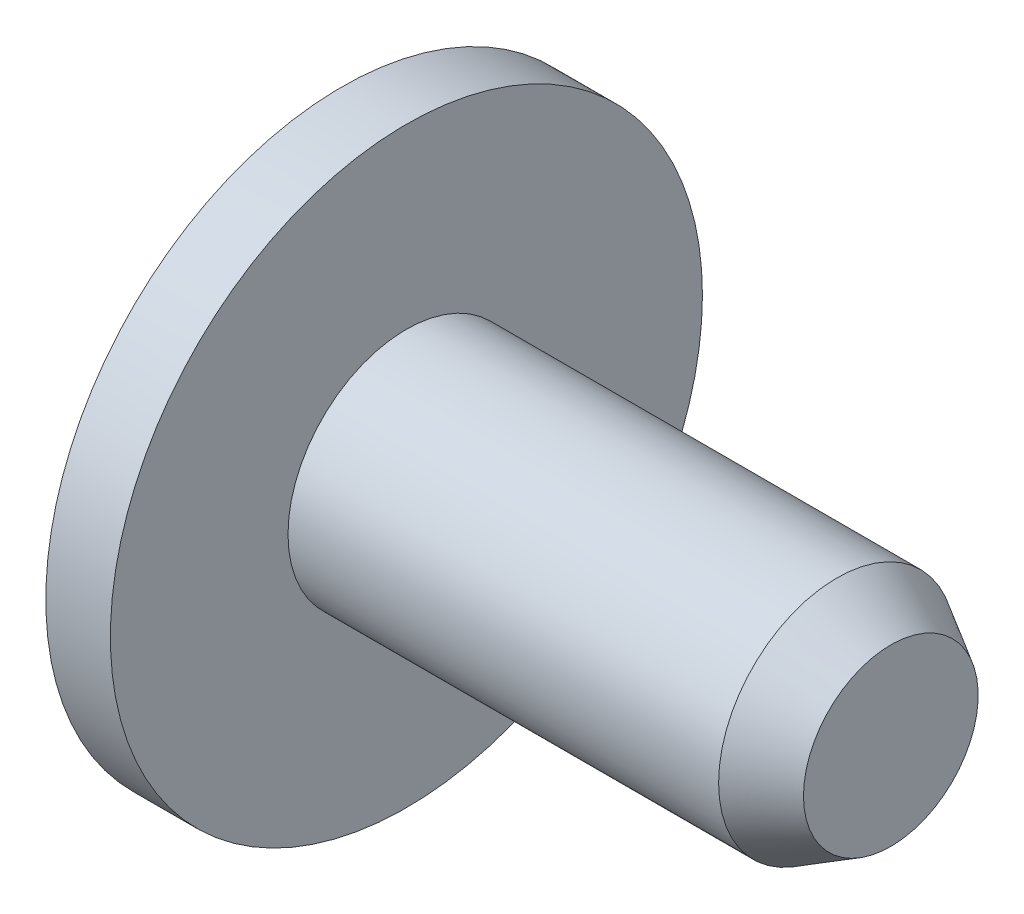
ISO-10303-21;
HEADER;
FILE_DESCRIPTION(('STEP AP214'),'2;1');
FILE_NAME('part.step','',(''),(''),'','','');
FILE_SCHEMA(('AUTOMOTIVE_DESIGN { 1 0 10303 214 1 1 1 1 }'));
ENDSEC;
DATA;
#1=APPLICATION_CONTEXT('core data for automotive mechanical design processes');
#2=APPLICATION_PROTOCOL_DEFINITION('international standard','automotive_design',2000,#1);
#3=PRODUCT_CONTEXT('',#1,'mechanical');
#4=PRODUCT('Part','Part','',(#3));
#5=PRODUCT_RELATED_PRODUCT_CATEGORY('part','',(#4));
#6=PRODUCT_DEFINITION_FORMATION('','',#4);
#7=PRODUCT_DEFINITION_CONTEXT('part definition',#1,'design');
#8=PRODUCT_DEFINITION('design','',#6,#7);
#9=PRODUCT_DEFINITION_SHAPE('','',#8);
#10=(LENGTH_UNIT() NAMED_UNIT(*) SI_UNIT(.MILLI.,.METRE.));
#11=(NAMED_UNIT(*) PLANE_ANGLE_UNIT() SI_UNIT($,.RADIAN.));
#12=(NAMED_UNIT(*) SI_UNIT($,.STERADIAN.) SOLID_ANGLE_UNIT());
#13=UNCERTAINTY_MEASURE_WITH_UNIT(LENGTH_MEASURE(1.E-05),#10,'distance_accuracy_value','');
#14=(GEOMETRIC_REPRESENTATION_CONTEXT(3) GLOBAL_UNCERTAINTY_ASSIGNED_CONTEXT((#13)) GLOBAL_UNIT_ASSIGNED_CONTEXT((#10,
#11,#12)) REPRESENTATION_CONTEXT('',''));
#15=CARTESIAN_POINT('',(0.,0.,0.));
#16=DIRECTION('',(0.,0.,1.));
#17=DIRECTION('',(1.,0.,0.));
#18=AXIS2_PLACEMENT_3D('',#15,#16,#17);
#19=CARTESIAN_POINT('',(4.5,0.811324865405192,0.));
#20=DIRECTION('',(-1.,0.,0.));
#21=DIRECTION('',(0.,0.,1.));
#22=AXIS2_PLACEMENT_3D('',#19,#20,#21);
#23=PLANE('',#22);
#24=CARTESIAN_POINT('',(4.5,0.,0.));
#25=DIRECTION('',(-1.,0.,0.));
#26=DIRECTION('',(0.,0.,1.));
#27=AXIS2_PLACEMENT_3D('',#24,#25,#26);
#28=CIRCLE('',#27,0.811324865405191);
#29=CARTESIAN_POINT('',(4.5,0.,0.811324865405154));
#30=VERTEX_POINT('',#29);
#31=EDGE_CURVE('E197',#30,#30,#28,.T.);
#32=ORIENTED_EDGE('',*,*,#31,.F.);
#33=EDGE_LOOP('',(#32));
#34=FACE_BOUND('',#33,.T.);
#35=ADVANCED_FACE('F40',(#34),#23,.F.);
#36=CARTESIAN_POINT('',(4.5,0.,0.));
#37=DIRECTION('',(-1.,0.,0.));
#38=DIRECTION('',(0.,0.,1.));
#39=AXIS2_PLACEMENT_3D('',#36,#37,#38);
#40=CONICAL_SURFACE('',#39,0.811324865405191,0.523598775598294);
#41=CARTESIAN_POINT('',(4.,0.,0.));
#42=DIRECTION('',(-1.,0.,0.));
#43=DIRECTION('',(0.,0.,1.));
#44=AXIS2_PLACEMENT_3D('',#41,#42,#43);
#45=CIRCLE('',#44,1.1);
#46=CARTESIAN_POINT('',(4.,0.,1.1));
#47=VERTEX_POINT('',#46);
#48=EDGE_CURVE('E193',#47,#47,#45,.T.);
#49=ORIENTED_EDGE('',*,*,#48,.F.);
#50=EDGE_LOOP('',(#49));
#51=FACE_BOUND('',#50,.T.);
#52=ORIENTED_EDGE('',*,*,#31,.T.);
#53=EDGE_LOOP('',(#52));
#54=FACE_BOUND('',#53,.T.);
#55=ADVANCED_FACE('F268',(#51,#54),#40,.T.);
#56=CARTESIAN_POINT('',(-2.18226579762636,0.,0.));
#57=DIRECTION('',(-1.,0.,0.));
#58=DIRECTION('',(0.,0.,1.));
#59=AXIS2_PLACEMENT_3D('',#56,#57,#58);
#60=CYLINDRICAL_SURFACE('',#59,1.1);
#61=CARTESIAN_POINT('',(0.,0.,0.));
#62=DIRECTION('',(-1.,0.,0.));
#63=DIRECTION('',(0.,0.,1.));
#64=AXIS2_PLACEMENT_3D('',#61,#62,#63);
#65=CIRCLE('',#64,1.1);
#66=CARTESIAN_POINT('',(0.,0.,1.10000000000001));
#67=VERTEX_POINT('',#66);
#68=EDGE_CURVE('E189',#67,#67,#65,.T.);
#69=ORIENTED_EDGE('',*,*,#68,.F.);
#70=EDGE_LOOP('',(#69));
#71=FACE_BOUND('',#70,.T.);
#72=ORIENTED_EDGE('',*,*,#48,.T.);
#73=EDGE_LOOP('',(#72));
#74=FACE_BOUND('',#73,.T.);
#75=ADVANCED_FACE('F263',(#71,#74),#60,.T.);
#76=CARTESIAN_POINT('',(0.,1.09999999999995,0.));
#77=DIRECTION('',(-1.,0.,0.));
#78=DIRECTION('',(0.,0.,1.));
#79=AXIS2_PLACEMENT_3D('',#76,#77,#78);
#80=PLANE('',#79);
#81=ORIENTED_EDGE('',*,*,#68,.T.);
#82=EDGE_LOOP('',(#81));
#83=FACE_BOUND('',#82,.T.);
#84=CARTESIAN_POINT('',(0.,0.,0.));
#85=DIRECTION('',(1.,0.,0.));
#86=DIRECTION('',(0.,0.,-1.));
#87=AXIS2_PLACEMENT_3D('',#84,#85,#86);
#88=CIRCLE('',#87,2.75);
#89=CARTESIAN_POINT('',(0.,0.,-2.75000000000001));
#90=VERTEX_POINT('',#89);
#91=EDGE_CURVE('E236',#90,#90,#88,.T.);
#92=ORIENTED_EDGE('',*,*,#91,.T.);
#93=EDGE_LOOP('',(#92));
#94=FACE_BOUND('',#93,.T.);
#95=ADVANCED_FACE('F251',(#83,#94),#80,.F.);
#96=CARTESIAN_POINT('',(-0.6,0.,0.));
#97=DIRECTION('',(1.,0.,0.));
#98=DIRECTION('',(0.,0.,-1.));
#99=AXIS2_PLACEMENT_3D('',#96,#97,#98);
#100=CYLINDRICAL_SURFACE('',#99,2.75);
#101=CARTESIAN_POINT('',(-0.6,0.,0.));
#102=DIRECTION('',(1.,0.,0.));
#103=DIRECTION('',(0.,0.,-1.));
#104=AXIS2_PLACEMENT_3D('',#101,#102,#103);
#105=CIRCLE('',#104,2.75);
#106=CARTESIAN_POINT('',(-0.6,0.,-2.75000000000001));
#107=VERTEX_POINT('',#106);
#108=EDGE_CURVE('E239',#107,#107,#105,.T.);
#109=ORIENTED_EDGE('',*,*,#108,.T.);
#110=EDGE_LOOP('',(#109));
#111=FACE_BOUND('',#110,.T.);
#112=ORIENTED_EDGE('',*,*,#91,.F.);
#113=EDGE_LOOP('',(#112));
#114=FACE_BOUND('',#113,.T.);
#115=ADVANCED_FACE('F253',(#111,#114),#100,.T.);
#116=CARTESIAN_POINT('',(-0.6,0.,0.));
#117=DIRECTION('',(1.,0.,0.));
#118=DIRECTION('',(0.,0.,-1.));
#119=AXIS2_PLACEMENT_3D('',#116,#117,#118);
#120=PLANE('',#119);
#121=CARTESIAN_POINT('',(-0.6,0.,0.));
#122=DIRECTION('',(1.,0.,0.));
#123=DIRECTION('',(0.,0.,-1.));
#124=AXIS2_PLACEMENT_3D('',#121,#122,#123);
#125=CIRCLE('',#124,1.88923048454133);
#126=CARTESIAN_POINT('',(-0.6,0.,-1.88923048454134));
#127=VERTEX_POINT('',#126);
#128=EDGE_CURVE('E11',#127,#127,#125,.T.);
#129=ORIENTED_EDGE('',*,*,#128,.T.);
#130=EDGE_LOOP('',(#129));
#131=FACE_BOUND('',#130,.T.);
#132=ORIENTED_EDGE('',*,*,#108,.F.);
#133=EDGE_LOOP('',(#132));
#134=FACE_BOUND('',#133,.T.);
#135=ADVANCED_FACE('F255',(#131,#134),#120,.F.);
#136=CARTESIAN_POINT('',(-1.2,-0.200000000000013,-2.05000000000002));
#137=DIRECTION('',(0.,-1.,0.));
#138=DIRECTION('',(1.,0.,0.));
#139=AXIS2_PLACEMENT_3D('',#136,#137,#138);
#140=PLANE('',#139);
#141=CARTESIAN_POINT('',(0.905985363406005,-0.20000000000002,0.));
#142=DIRECTION('',(0.,-1.,0.));
#143=DIRECTION('',(1.,0.,0.));
#144=AXIS2_PLACEMENT_3D('',#141,#142,#143);
#145=CIRCLE('',#144,2.49799172168467);
#146=CARTESIAN_POINT('',(-1.58398705443421,-0.200000000000033,-0.20000000000002));
#147=VERTEX_POINT('',#146);
#148=CARTESIAN_POINT('',(-1.19999999999998,-0.200000000000006,-1.34342409191025));
#149=VERTEX_POINT('',#148);
#150=EDGE_CURVE('E174',#147,#149,#145,.T.);
#151=ORIENTED_EDGE('',*,*,#150,.F.);
#152=DIRECTION('',(1.,0.,0.));
#153=VECTOR('',#152,1.);
#154=CARTESIAN_POINT('',(-1.19999999999998,-0.200000000000023,-0.200000000000027));
#155=LINE('',#154,#153);
#156=CARTESIAN_POINT('',(-1.19999999999998,-0.200000000000034,-0.20000000000002));
#157=VERTEX_POINT('',#156);
#158=EDGE_CURVE('E49',#147,#157,#155,.T.);
#159=ORIENTED_EDGE('',*,*,#158,.T.);
#160=DIRECTION('',(0.,0.,1.));
#161=VECTOR('',#160,1.);
#162=CARTESIAN_POINT('',(-1.2,-0.200000000000013,-2.05000000000002));
#163=LINE('',#162,#161);
#164=EDGE_CURVE('E172',#149,#157,#163,.T.);
#165=ORIENTED_EDGE('',*,*,#164,.F.);
#166=EDGE_LOOP('',(#151,#159,#165));
#167=FACE_BOUND('',#166,.T.);
#168=ADVANCED_FACE('F171',(#167),#140,.F.);
#169=CARTESIAN_POINT('',(-1.19999999999998,-2.05000000000004,-0.200000000000027));
#170=DIRECTION('',(0.,0.,-1.));
#171=DIRECTION('',(0.,1.,0.));
#172=AXIS2_PLACEMENT_3D('',#169,#170,#171);
#173=PLANE('',#172);
#174=DIRECTION('',(0.,1.,0.));
#175=VECTOR('',#174,1.);
#176=CARTESIAN_POINT('',(-1.19999999999998,-2.05000000000004,-0.200000000000027));
#177=LINE('',#176,#175);
#178=CARTESIAN_POINT('',(-1.2,-1.34342409191023,-0.200000000000027));
#179=VERTEX_POINT('',#178);
#180=EDGE_CURVE('E114',#179,#157,#177,.T.);
#181=ORIENTED_EDGE('',*,*,#180,.T.);
#182=ORIENTED_EDGE('',*,*,#158,.F.);
#183=CARTESIAN_POINT('',(0.905985363406026,0.,-0.200000000000082));
#184=DIRECTION('',(0.,0.,-1.));
#185=DIRECTION('',(0.,1.,0.));
#186=AXIS2_PLACEMENT_3D('',#183,#184,#185);
#187=CIRCLE('',#186,2.49799172168467);
#188=EDGE_CURVE('E209',#179,#147,#187,.T.);
#189=ORIENTED_EDGE('',*,*,#188,.F.);
#190=EDGE_LOOP('',(#181,#182,#189));
#191=FACE_BOUND('',#190,.T.);
#192=ADVANCED_FACE('F288',(#191),#173,.F.);
#193=CARTESIAN_POINT('',(-1.2,-2.05000000000004,0.199999999999957));
#194=DIRECTION('',(0.,0.,1.));
#195=DIRECTION('',(0.,-1.,0.));
#196=AXIS2_PLACEMENT_3D('',#193,#194,#195);
#197=PLANE('',#196);
#198=DIRECTION('',(-1.,0.,0.));
#199=VECTOR('',#198,1.);
#200=CARTESIAN_POINT('',(-1.2,-0.200000000000006,0.199999999999984));
#201=LINE('',#200,#199);
#202=CARTESIAN_POINT('',(-1.2,-0.200000000000006,0.199999999999957));
#203=VERTEX_POINT('',#202);
#204=CARTESIAN_POINT('',(-1.58398705443423,-0.200000000000009,0.199999999999978));
#205=VERTEX_POINT('',#204);
#206=EDGE_CURVE('E122',#203,#205,#201,.T.);
#207=ORIENTED_EDGE('',*,*,#206,.F.);
#208=DIRECTION('',(0.,1.,0.));
#209=VECTOR('',#208,1.);
#210=CARTESIAN_POINT('',(-1.2,-2.05000000000004,0.199999999999957));
#211=LINE('',#210,#209);
#212=CARTESIAN_POINT('',(-1.2,-1.34342409191023,0.199999999999978));
#213=VERTEX_POINT('',#212);
#214=EDGE_CURVE('E111',#213,#203,#211,.T.);
#215=ORIENTED_EDGE('',*,*,#214,.F.);
#216=CARTESIAN_POINT('',(0.905985363406008,0.,0.199999999999977));
#217=DIRECTION('',(0.,0.,1.));
#218=DIRECTION('',(0.,-1.,0.));
#219=AXIS2_PLACEMENT_3D('',#216,#217,#218);
#220=CIRCLE('',#219,2.49799172168467);
#221=EDGE_CURVE('E64',#205,#213,#220,.T.);
#222=ORIENTED_EDGE('',*,*,#221,.F.);
#223=EDGE_LOOP('',(#207,#215,#222));
#224=FACE_BOUND('',#223,.T.);
#225=ADVANCED_FACE('F121',(#224),#197,.F.);
#226=CARTESIAN_POINT('',(-1.2,-0.199999999999978,1.34342409191022));
#227=VERTEX_POINT('',#226);
#228=EDGE_CURVE('E179',#203,#227,#163,.T.);
#229=ORIENTED_EDGE('',*,*,#228,.F.);
#230=ORIENTED_EDGE('',*,*,#206,.T.);
#231=EDGE_CURVE('E132',#227,#205,#145,.T.);
#232=ORIENTED_EDGE('',*,*,#231,.F.);
#233=EDGE_LOOP('',(#229,#230,#232));
#234=FACE_BOUND('',#233,.T.);
#235=ADVANCED_FACE('F293',(#234),#140,.F.);
#236=CARTESIAN_POINT('',(-1.2,0.200000000000019,-2.05000000000004));
#237=DIRECTION('',(0.,1.,0.));
#238=DIRECTION('',(-1.,0.,0.));
#239=AXIS2_PLACEMENT_3D('',#236,#237,#238);
#240=PLANE('',#239);
#241=CARTESIAN_POINT('',(0.905985363406005,0.199999999999988,0.));
#242=DIRECTION('',(0.,1.,0.));
#243=DIRECTION('',(-1.,0.,0.));
#244=AXIS2_PLACEMENT_3D('',#241,#242,#243);
#245=CIRCLE('',#244,2.49799172168467);
#246=CARTESIAN_POINT('',(-1.58398705443423,0.199999999999991,0.199999999999985));
#247=VERTEX_POINT('',#246);
#248=CARTESIAN_POINT('',(-1.19999999999998,0.200000000000006,1.34342409191022));
#249=VERTEX_POINT('',#248);
#250=EDGE_CURVE('E146',#247,#249,#245,.T.);
#251=ORIENTED_EDGE('',*,*,#250,.F.);
#252=DIRECTION('',(1.,0.,0.));
#253=VECTOR('',#252,1.);
#254=CARTESIAN_POINT('',(-1.2,0.199999999999991,0.199999999999985));
#255=LINE('',#254,#253);
#256=CARTESIAN_POINT('',(-1.2,0.199999999999991,0.199999999999985));
#257=VERTEX_POINT('',#256);
#258=EDGE_CURVE('E134',#247,#257,#255,.T.);
#259=ORIENTED_EDGE('',*,*,#258,.T.);
#260=DIRECTION('',(0.,0.,1.));
#261=VECTOR('',#260,1.);
#262=CARTESIAN_POINT('',(-1.2,0.200000000000019,-2.05000000000004));
#263=LINE('',#262,#261);
#264=EDGE_CURVE('E151',#257,#249,#263,.T.);
#265=ORIENTED_EDGE('',*,*,#264,.T.);
#266=EDGE_LOOP('',(#251,#259,#265));
#267=FACE_BOUND('',#266,.T.);
#268=ADVANCED_FACE('F150',(#267),#240,.F.);
#269=CARTESIAN_POINT('',(-1.19999999999998,1.34342409191022,0.199999999999944));
#270=VERTEX_POINT('',#269);
#271=EDGE_CURVE('E56',#257,#270,#211,.T.);
#272=ORIENTED_EDGE('',*,*,#271,.F.);
#273=ORIENTED_EDGE('',*,*,#258,.F.);
#274=EDGE_CURVE('E119',#270,#247,#220,.T.);
#275=ORIENTED_EDGE('',*,*,#274,.F.);
#276=EDGE_LOOP('',(#272,#273,#275));
#277=FACE_BOUND('',#276,.T.);
#278=ADVANCED_FACE('F292',(#277),#197,.F.);
#279=CARTESIAN_POINT('',(-1.2,-0.200000000000013,-2.05000000000002));
#280=DIRECTION('',(1.,0.,0.));
#281=DIRECTION('',(0.,0.,-1.));
#282=AXIS2_PLACEMENT_3D('',#279,#280,#281);
#283=PLANE('',#282);
#284=ORIENTED_EDGE('',*,*,#264,.F.);
#285=ORIENTED_EDGE('',*,*,#271,.T.);
#286=CARTESIAN_POINT('',(-1.2,0.,0.));
#287=DIRECTION('',(1.,0.,0.));
#288=DIRECTION('',(0.,0.,-1.));
#289=AXIS2_PLACEMENT_3D('',#286,#287,#288);
#290=CIRCLE('',#289,1.35822983722373);
#291=CARTESIAN_POINT('',(-1.19999999999996,1.3434240919102,-0.200000000000041));
#292=VERTEX_POINT('',#291);
#293=EDGE_CURVE('E118',#292,#270,#290,.T.);
#294=ORIENTED_EDGE('',*,*,#293,.F.);
#295=CARTESIAN_POINT('',(-1.2,0.199999999999978,-0.200000000000013));
#296=VERTEX_POINT('',#295);
#297=EDGE_CURVE('E124',#296,#292,#177,.T.);
#298=ORIENTED_EDGE('',*,*,#297,.F.);
#299=CARTESIAN_POINT('',(-1.2,0.200000000000013,-1.34342409191025));
#300=VERTEX_POINT('',#299);
#301=EDGE_CURVE('E184',#300,#296,#263,.T.);
#302=ORIENTED_EDGE('',*,*,#301,.F.);
#303=CARTESIAN_POINT('',(-1.2,0.,0.));
#304=DIRECTION('',(1.,0.,0.));
#305=DIRECTION('',(0.,0.,-1.));
#306=AXIS2_PLACEMENT_3D('',#303,#304,#305);
#307=CIRCLE('',#306,1.35822983722373);
#308=EDGE_CURVE('E160',#149,#300,#307,.T.);
#309=ORIENTED_EDGE('',*,*,#308,.F.);
#310=ORIENTED_EDGE('',*,*,#164,.T.);
#311=ORIENTED_EDGE('',*,*,#180,.F.);
#312=EDGE_CURVE('E108',#213,#179,#290,.T.);
#313=ORIENTED_EDGE('',*,*,#312,.F.);
#314=ORIENTED_EDGE('',*,*,#214,.T.);
#315=ORIENTED_EDGE('',*,*,#228,.T.);
#316=EDGE_CURVE('E155',#249,#227,#307,.T.);
#317=ORIENTED_EDGE('',*,*,#316,.F.);
#318=EDGE_LOOP('',(#284,#285,#294,#298,#302,#309,#310,#311,#313,#314,#315,#317));
#319=FACE_BOUND('',#318,.T.);
#320=ADVANCED_FACE('F110',(#319),#283,.F.);
#321=DIRECTION('',(-1.,0.,0.));
#322=VECTOR('',#321,1.);
#323=CARTESIAN_POINT('',(-1.2,0.199999999999978,-0.200000000000013));
#324=LINE('',#323,#322);
#325=CARTESIAN_POINT('',(-1.58398705443423,0.199999999999984,-0.200000000000013));
#326=VERTEX_POINT('',#325);
#327=EDGE_CURVE('E211',#296,#326,#324,.T.);
#328=ORIENTED_EDGE('',*,*,#327,.F.);
#329=ORIENTED_EDGE('',*,*,#297,.T.);
#330=EDGE_CURVE('E186',#326,#292,#187,.T.);
#331=ORIENTED_EDGE('',*,*,#330,.F.);
#332=EDGE_LOOP('',(#328,#329,#331));
#333=FACE_BOUND('',#332,.T.);
#334=ADVANCED_FACE('F221',(#333),#173,.F.);
#335=ORIENTED_EDGE('',*,*,#301,.T.);
#336=ORIENTED_EDGE('',*,*,#327,.T.);
#337=EDGE_CURVE('E154',#300,#326,#245,.T.);
#338=ORIENTED_EDGE('',*,*,#337,.F.);
#339=EDGE_LOOP('',(#335,#336,#338));
#340=FACE_BOUND('',#339,.T.);
#341=ADVANCED_FACE('F225',(#340),#240,.F.);
#342=CARTESIAN_POINT('',(0.905985363406005,0.,0.));
#343=DIRECTION('',(-1.,0.,0.));
#344=DIRECTION('',(0.,1.,0.));
#345=AXIS2_PLACEMENT_3D('',#342,#343,#344);
#346=SPHERICAL_SURFACE('',#345,2.50598536340601);
#347=ORIENTED_EDGE('',*,*,#337,.T.);
#348=ORIENTED_EDGE('',*,*,#330,.T.);
#349=ORIENTED_EDGE('',*,*,#293,.T.);
#350=ORIENTED_EDGE('',*,*,#274,.T.);
#351=ORIENTED_EDGE('',*,*,#250,.T.);
#352=ORIENTED_EDGE('',*,*,#316,.T.);
#353=ORIENTED_EDGE('',*,*,#231,.T.);
#354=ORIENTED_EDGE('',*,*,#221,.T.);
#355=ORIENTED_EDGE('',*,*,#312,.T.);
#356=ORIENTED_EDGE('',*,*,#188,.T.);
#357=ORIENTED_EDGE('',*,*,#150,.T.);
#358=ORIENTED_EDGE('',*,*,#308,.T.);
#359=EDGE_LOOP('',(#347,#348,#349,#350,#351,#352,#353,#354,#355,#356,#357,#358));
#360=FACE_BOUND('',#359,.T.);
#361=CARTESIAN_POINT('',(-0.799999999999999,0.,0.));
#362=DIRECTION('',(-1.,0.,0.));
#363=DIRECTION('',(0.,0.,1.));
#364=AXIS2_PLACEMENT_3D('',#361,#362,#363);
#365=CIRCLE('',#364,1.83564064605511);
#366=CARTESIAN_POINT('',(-0.799999999999999,0.,1.83564064605512));
#367=VERTEX_POINT('',#366);
#368=EDGE_CURVE('E201',#367,#367,#365,.T.);
#369=ORIENTED_EDGE('',*,*,#368,.T.);
#370=EDGE_LOOP('',(#369));
#371=FACE_BOUND('',#370,.T.);
#372=ADVANCED_FACE('F128',(#360,#371),#346,.T.);
#373=CARTESIAN_POINT('',(0.,0.,0.));
#374=DIRECTION('',(1.,0.,0.));
#375=DIRECTION('',(0.,0.,-1.));
#376=AXIS2_PLACEMENT_3D('',#373,#374,#375);
#377=CONICAL_SURFACE('',#376,2.05,0.261799387799143);
#378=ORIENTED_EDGE('',*,*,#368,.F.);
#379=EDGE_LOOP('',(#378));
#380=FACE_BOUND('',#379,.T.);
#381=ORIENTED_EDGE('',*,*,#128,.F.);
#382=EDGE_LOOP('',(#381));
#383=FACE_BOUND('',#382,.T.);
#384=ADVANCED_FACE('F42',(#380,#383),#377,.T.);
#385=CLOSED_SHELL('',(#35,#55,#75,#95,#115,#135,#168,#192,#225,#235,#268,#278,#320,#334,#341,
#372,#384));
#386=MANIFOLD_SOLID_BREP('B2',#385);
#387=ADVANCED_BREP_SHAPE_REPRESENTATION('',(#18,#386),#14);
#388=SHAPE_DEFINITION_REPRESENTATION(#9,#387);
ENDSEC;
END-ISO-10303-21;
